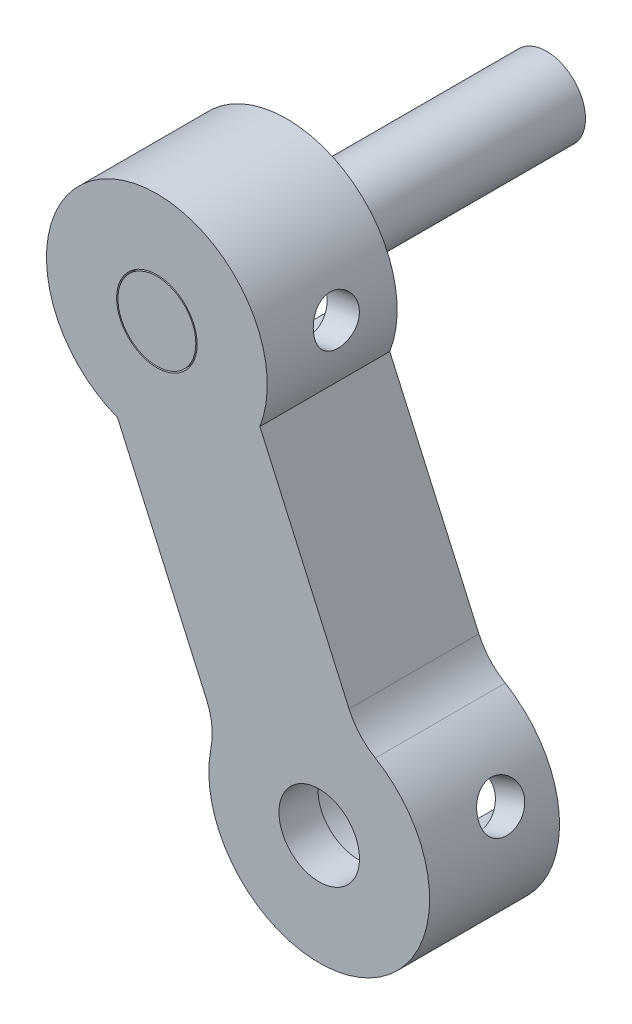
ISO-10303-21;
HEADER;
FILE_DESCRIPTION(('STEP AP214'),'2;1');
FILE_NAME('part.step','',(''),(''),'','','');
FILE_SCHEMA(('AUTOMOTIVE_DESIGN { 1 0 10303 214 1 1 1 1 }'));
ENDSEC;
DATA;
#1=APPLICATION_CONTEXT('core data for automotive mechanical design processes');
#2=APPLICATION_PROTOCOL_DEFINITION('international standard','automotive_design',2000,#1);
#3=PRODUCT_CONTEXT('',#1,'mechanical');
#4=PRODUCT('Part','Part','',(#3));
#5=PRODUCT_RELATED_PRODUCT_CATEGORY('part','',(#4));
#6=PRODUCT_DEFINITION_FORMATION('','',#4);
#7=PRODUCT_DEFINITION_CONTEXT('part definition',#1,'design');
#8=PRODUCT_DEFINITION('design','',#6,#7);
#9=PRODUCT_DEFINITION_SHAPE('','',#8);
#10=(LENGTH_UNIT() NAMED_UNIT(*) SI_UNIT(.MILLI.,.METRE.));
#11=(NAMED_UNIT(*) PLANE_ANGLE_UNIT() SI_UNIT($,.RADIAN.));
#12=(NAMED_UNIT(*) SI_UNIT($,.STERADIAN.) SOLID_ANGLE_UNIT());
#13=UNCERTAINTY_MEASURE_WITH_UNIT(LENGTH_MEASURE(1.E-05),#10,'distance_accuracy_value','');
#14=(GEOMETRIC_REPRESENTATION_CONTEXT(3) GLOBAL_UNCERTAINTY_ASSIGNED_CONTEXT((#13)) GLOBAL_UNIT_ASSIGNED_CONTEXT((#10,
#11,#12)) REPRESENTATION_CONTEXT('',''));
#15=CARTESIAN_POINT('',(0.,0.,0.));
#16=DIRECTION('',(0.,0.,1.));
#17=DIRECTION('',(1.,0.,0.));
#18=AXIS2_PLACEMENT_3D('',#15,#16,#17);
#19=CARTESIAN_POINT('',(-13.5971222503713,29.925411936819,11.5));
#20=DIRECTION('',(0.,0.,1.));
#21=DIRECTION('',(1.,0.,0.));
#22=AXIS2_PLACEMENT_3D('',#19,#20,#21);
#23=CYLINDRICAL_SURFACE('',#22,3.);
#24=CARTESIAN_POINT('',(-13.5971222503713,29.925411936819,11.5));
#25=DIRECTION('',(0.,0.,1.));
#26=DIRECTION('',(1.,0.,0.));
#27=AXIS2_PLACEMENT_3D('',#24,#25,#26);
#28=CIRCLE('',#27,3.);
#29=CARTESIAN_POINT('',(-10.5971222503713,29.925411936819,11.5));
#30=VERTEX_POINT('',#29);
#31=EDGE_CURVE('E11',#30,#30,#28,.T.);
#32=ORIENTED_EDGE('',*,*,#31,.T.);
#33=EDGE_LOOP('',(#32));
#34=FACE_BOUND('',#33,.T.);
#35=CARTESIAN_POINT('',(-13.5971222503713,29.925411936819,41.5));
#36=DIRECTION('',(0.,0.,1.));
#37=DIRECTION('',(1.,0.,0.));
#38=AXIS2_PLACEMENT_3D('',#35,#36,#37);
#39=CIRCLE('',#38,3.);
#40=CARTESIAN_POINT('',(-10.5971222503713,29.925411936819,41.5));
#41=VERTEX_POINT('',#40);
#42=EDGE_CURVE('E50',#41,#41,#39,.T.);
#43=ORIENTED_EDGE('',*,*,#42,.F.);
#44=EDGE_LOOP('',(#43));
#45=FACE_BOUND('',#44,.T.);
#46=ADVANCED_FACE('F47',(#34,#45),#23,.T.);
#47=CARTESIAN_POINT('',(-13.5971222503713,29.925411936819,11.5));
#48=DIRECTION('',(0.,0.,1.));
#49=DIRECTION('',(1.,0.,0.));
#50=AXIS2_PLACEMENT_3D('',#47,#48,#49);
#51=PLANE('',#50);
#52=ORIENTED_EDGE('',*,*,#31,.F.);
#53=EDGE_LOOP('',(#52));
#54=FACE_BOUND('',#53,.T.);
#55=ADVANCED_FACE('F62',(#54),#51,.F.);
#56=CARTESIAN_POINT('',(-13.5971222503713,29.925411936819,41.5));
#57=DIRECTION('',(0.,0.,1.));
#58=DIRECTION('',(1.,0.,0.));
#59=AXIS2_PLACEMENT_3D('',#56,#57,#58);
#60=PLANE('',#59);
#61=ORIENTED_EDGE('',*,*,#42,.T.);
#62=EDGE_LOOP('',(#61));
#63=FACE_BOUND('',#62,.T.);
#64=ADVANCED_FACE('F59',(#63),#60,.T.);
#65=CLOSED_SHELL('',(#46,#55,#64));
#66=MANIFOLD_SOLID_BREP('B2',#65);
#67=CARTESIAN_POINT('',(-1.09712225037129,1.88544046750395,7.84956230400222));
#68=DIRECTION('',(0.,0.,1.));
#69=DIRECTION('',(1.,0.,0.));
#70=AXIS2_PLACEMENT_3D('',#67,#68,#69);
#71=CYLINDRICAL_SURFACE('',#70,8.5);
#72=CARTESIAN_POINT('',(-1.09712225037129,1.88544046750395,31.5));
#73=DIRECTION('',(0.,0.,1.));
#74=DIRECTION('',(1.,0.,0.));
#75=AXIS2_PLACEMENT_3D('',#72,#73,#74);
#76=CIRCLE('',#75,8.5);
#77=CARTESIAN_POINT('',(3.22233619636106,9.20611521283669,31.5));
#78=VERTEX_POINT('',#77);
#79=CARTESIAN_POINT('',(-9.42930975553159,3.5661103871641,31.5));
#80=VERTEX_POINT('',#79);
#81=EDGE_CURVE('E634',#78,#80,#76,.F.);
#82=ORIENTED_EDGE('',*,*,#81,.F.);
#83=DIRECTION('',(0.,0.,1.));
#84=VECTOR('',#83,1.);
#85=CARTESIAN_POINT('',(3.22233619636106,9.20611521283669,7.84956230400222));
#86=LINE('',#85,#84);
#87=CARTESIAN_POINT('',(3.22233619636106,9.20611521283669,41.5));
#88=VERTEX_POINT('',#87);
#89=EDGE_CURVE('E652',#78,#88,#86,.T.);
#90=ORIENTED_EDGE('',*,*,#89,.T.);
#91=CARTESIAN_POINT('',(-1.09712225037129,1.88544046750395,41.5));
#92=DIRECTION('',(0.,0.,1.));
#93=DIRECTION('',(1.,0.,0.));
#94=AXIS2_PLACEMENT_3D('',#91,#92,#93);
#95=CIRCLE('',#94,8.5);
#96=CARTESIAN_POINT('',(-9.42930975553159,3.5661103871641,41.5));
#97=VERTEX_POINT('',#96);
#98=EDGE_CURVE('E633',#97,#88,#95,.T.);
#99=ORIENTED_EDGE('',*,*,#98,.F.);
#100=DIRECTION('',(0.,0.,1.));
#101=VECTOR('',#100,1.);
#102=CARTESIAN_POINT('',(-9.42930975553159,3.5661103871641,7.84956230400222));
#103=LINE('',#102,#101);
#104=EDGE_CURVE('E386',#97,#80,#103,.F.);
#105=ORIENTED_EDGE('',*,*,#104,.T.);
#106=EDGE_LOOP('',(#82,#90,#99,#105));
#107=FACE_BOUND('',#106,.T.);
#108=CARTESIAN_POINT('',(7.31858484996942,3.07954012887019,35.5));
#109=CARTESIAN_POINT('',(7.3185854797486,3.07954410286317,35.4028260396532));
#110=CARTESIAN_POINT('',(7.31743094588016,3.08776128160363,35.3056083726023));
#111=CARTESIAN_POINT('',(7.31271128953919,3.12033341840625,35.113927668718));
#112=CARTESIAN_POINT('',(7.3091442950747,3.14470090829697,35.0194668305173));
#113=CARTESIAN_POINT('',(7.29931674287809,3.20863749879655,34.8361005124985));
#114=CARTESIAN_POINT('',(7.29305894750487,3.24819100509045,34.7471894422291));
#115=CARTESIAN_POINT('',(7.27743559938223,3.34111585001684,34.5772261269787));
#116=CARTESIAN_POINT('',(7.2680701864493,3.39448656696806,34.4961735286448));
#117=CARTESIAN_POINT('',(7.2456089372722,3.51411464691291,34.3430105710338));
#118=CARTESIAN_POINT('',(7.23246464867289,3.58053558950208,34.2710350592075));
#119=CARTESIAN_POINT('',(7.20204207979092,3.72370529883247,34.1392477825047));
#120=CARTESIAN_POINT('',(7.18476350055072,3.80045481227441,34.0794368978518));
#121=CARTESIAN_POINT('',(7.14557283842902,3.96269721326868,33.973150308298));
#122=CARTESIAN_POINT('',(7.1236193278135,4.04826448861869,33.9268032261375));
#123=CARTESIAN_POINT('',(7.07510478966391,4.22490251975853,33.8495905041948));
#124=CARTESIAN_POINT('',(7.04854421977505,4.31597272832594,33.81872332789));
#125=CARTESIAN_POINT('',(6.99149443986236,4.49951445398659,33.7737677336255));
#126=CARTESIAN_POINT('',(6.9610651488198,4.5919487461683,33.7594514439322));
#127=CARTESIAN_POINT('',(6.89665201134979,4.77665733728638,33.7472925994424));
#128=CARTESIAN_POINT('',(6.86266852736262,4.8689316515629,33.7494483665136));
#129=CARTESIAN_POINT('',(6.79271378430365,5.0492520971896,33.7700005591601));
#130=CARTESIAN_POINT('',(6.7567802479912,5.13734101490225,33.7881514822769));
#131=CARTESIAN_POINT('',(6.68375573066098,5.30839118157257,33.8397887948544));
#132=CARTESIAN_POINT('',(6.64666470147465,5.39135221670628,33.8732758233156));
#133=CARTESIAN_POINT('',(6.57258085719244,5.55060427437291,33.9548590559881));
#134=CARTESIAN_POINT('',(6.53559031696466,5.62684751626834,34.0030504861308));
#135=CARTESIAN_POINT('',(6.46359856849392,5.77027639570539,34.1126039198916));
#136=CARTESIAN_POINT('',(6.42859760275988,5.83746093044606,34.1739675247286));
#137=CARTESIAN_POINT('',(6.36164438884661,5.96244027964255,34.3094671494901));
#138=CARTESIAN_POINT('',(6.32976034803723,6.02003886334257,34.3838180389386));
#139=CARTESIAN_POINT('',(6.27148778689696,6.1230220549836,34.5424736860283));
#140=CARTESIAN_POINT('',(6.24509938330184,6.16840640348148,34.6267786550499));
#141=CARTESIAN_POINT('',(6.1992773907361,6.24601357713369,34.8032590701985));
#142=CARTESIAN_POINT('',(6.17986048020693,6.27820486517221,34.8954527457412));
#143=CARTESIAN_POINT('',(6.14927528940594,6.32847968603942,35.0849136829193));
#144=CARTESIAN_POINT('',(6.13810586382014,6.34656517773529,35.1821802380834));
#145=CARTESIAN_POINT('',(6.12486209438162,6.36797316937532,35.3771384856807));
#146=CARTESIAN_POINT('',(6.12262668151185,6.37155712859385,35.4747905689173));
#147=CARTESIAN_POINT('',(6.12695061495697,6.36459078082769,35.6693884592882));
#148=CARTESIAN_POINT('',(6.13350943075216,6.35404132645383,35.766334308672));
#149=CARTESIAN_POINT('',(6.15488896035974,6.31925810337725,35.9557459369636));
#150=CARTESIAN_POINT('',(6.16962421188252,6.29516585417732,36.048247477557));
#151=CARTESIAN_POINT('',(6.20640644604776,6.23397300184239,36.2273008542394));
#152=CARTESIAN_POINT('',(6.22845406136546,6.19687127309433,36.3138521747251));
#153=CARTESIAN_POINT('',(6.2789574013478,6.10989345597836,36.4798597535919));
#154=CARTESIAN_POINT('',(6.30749712668696,6.05984861812149,36.5592019972628));
#155=CARTESIAN_POINT('',(6.36926333482115,5.94833839436772,36.7073420239533));
#156=CARTESIAN_POINT('',(6.40249033013136,5.88687175935594,36.7761386521761));
#157=CARTESIAN_POINT('',(6.47252808036353,5.75276488741944,36.9023830259));
#158=CARTESIAN_POINT('',(6.50938853161499,5.67995845155516,36.9596269124008));
#159=CARTESIAN_POINT('',(6.58443642352807,5.52563379698854,37.0596912922216));
#160=CARTESIAN_POINT('',(6.62262380631305,5.44411595792957,37.1025124137491));
#161=CARTESIAN_POINT('',(6.6983837329635,5.27492693085168,37.1722226027149));
#162=CARTESIAN_POINT('',(6.73595858865205,5.18729548576855,37.1992054791553));
#163=CARTESIAN_POINT('',(6.80920959045461,5.00782769998812,37.2367692531238));
#164=CARTESIAN_POINT('',(6.84488597902804,4.9159918990432,37.2473522500121));
#165=CARTESIAN_POINT('',(6.91248066992904,4.73248249930024,37.2517305363926));
#166=CARTESIAN_POINT('',(6.94445611988901,4.64083710995006,37.2458316563123));
#167=CARTESIAN_POINT('',(7.00457277545334,4.45871383356561,37.2180915918652));
#168=CARTESIAN_POINT('',(7.03271403529362,4.36823593003326,37.1962506330324));
#169=CARTESIAN_POINT('',(7.08464581712309,4.19133620829888,37.1373856571765));
#170=CARTESIAN_POINT('',(7.10844723012653,4.10490465282499,37.100400424893));
#171=CARTESIAN_POINT('',(7.151690638844,3.93836447094919,37.0123364965841));
#172=CARTESIAN_POINT('',(7.17113226504039,3.85825638087083,36.9612566067712));
#173=CARTESIAN_POINT('',(7.20612901853282,3.70540691970761,36.8454321612645));
#174=CARTESIAN_POINT('',(7.22161240122035,3.63281405723092,36.7804699227872));
#175=CARTESIAN_POINT('',(7.24864156977466,3.49879458039844,36.6391696494642));
#176=CARTESIAN_POINT('',(7.26018641792897,3.43737062683406,36.5628289117577));
#177=CARTESIAN_POINT('',(7.2799278976684,3.32704260818699,36.3998803653623));
#178=CARTESIAN_POINT('',(7.28808433544643,3.27829127172515,36.3131641988786));
#179=CARTESIAN_POINT('',(7.30134135139825,3.19599769902188,36.1326324759066));
#180=CARTESIAN_POINT('',(7.30644464676251,3.16244194572574,36.0388233159514));
#181=CARTESIAN_POINT('',(7.3130524048415,3.11804889592078,35.8706966943004));
#182=CARTESIAN_POINT('',(7.31513588401968,3.10363907892756,35.7973245577807));
#183=CARTESIAN_POINT('',(7.31790183767546,3.08438335256718,35.6493101834569));
#184=CARTESIAN_POINT('',(7.31858436605019,3.07953707527348,35.5746679946255));
#185=CARTESIAN_POINT('',(7.31858484996942,3.07954012887019,35.5));
#186=B_SPLINE_CURVE_WITH_KNOTS('',3,(#108,#109,#110,#111,#112,#113,#114,#115,#116,#117,#118,
#119,#120,#121,#122,#123,#124,#125,#126,#127,#128,#129,#130,#131,#132,#133,#134,#135,#136,#137,
#138,#139,#140,#141,#142,#143,#144,#145,#146,#147,#148,#149,#150,#151,#152,#153,#154,#155,#156,
#157,#158,#159,#160,#161,#162,#163,#164,#165,#166,#167,#168,#169,#170,#171,#172,#173,#174,#175,
#176,#177,#178,#179,#180,#181,#182,#183,#184,#185),.UNSPECIFIED.,.T.,.F.,(4,2,2,2,2,2,2,2,2,2,2,
2,2,2,2,2,2,2,2,2,2,2,2,2,2,2,2,2,2,2,2,2,2,2,2,2,2,2,4),(0.,0.291248410109941,0.58272307932389,
0.873899234245207,1.16506229047974,1.46013917865947,1.75523741079963,2.05306846375926,
2.35086994840377,2.64452056558611,2.93814126677126,3.22733231136036,3.5165354065992,
3.80765263306367,4.09880526800797,4.39533262812759,4.69186628630141,4.98910471071327,
5.28630185037215,5.57811605401199,5.86991265449102,6.15871525555436,6.4475428507167,
6.7403446903132,7.03317857028093,7.33079842962615,7.62840532396935,7.92423124331004,
8.22001929063563,8.51035546543439,8.8006875329035,9.09028065985293,9.37989832225806,
9.6744430191927,9.96905779442417,10.2670738865042,10.5648243585657,10.7886268189702,
11.0124206691245),.UNSPECIFIED.);
#187=CARTESIAN_POINT('',(7.31858484996942,3.07954012887019,35.5));
#188=VERTEX_POINT('',#187);
#189=EDGE_CURVE('E273',#188,#188,#186,.T.);
#190=ORIENTED_EDGE('',*,*,#189,.F.);
#191=EDGE_LOOP('',(#190));
#192=FACE_BOUND('',#191,.T.);
#193=ADVANCED_FACE('F88',(#107,#192),#71,.T.);
#194=CARTESIAN_POINT('',(-1.09712225037129,1.88544046750395,38.5));
#195=DIRECTION('',(0.,0.,-1.));
#196=DIRECTION('',(-1.,0.,0.));
#197=AXIS2_PLACEMENT_3D('',#194,#195,#196);
#198=CYLINDRICAL_SURFACE('',#197,4.9);
#199=DIRECTION('',(0.,0.,-1.));
#200=VECTOR('',#199,1.);
#201=CARTESIAN_POINT('',(3.80217856920049,1.80266680416017,43.1083798265215));
#202=LINE('',#201,#200);
#203=CARTESIAN_POINT('',(3.80217856920049,1.80266680416017,38.5));
#204=VERTEX_POINT('',#203);
#205=CARTESIAN_POINT('',(3.80217856920049,1.80266680416017,32.5));
#206=VERTEX_POINT('',#205);
#207=EDGE_CURVE('E209',#204,#206,#202,.T.);
#208=ORIENTED_EDGE('',*,*,#207,.T.);
#209=CARTESIAN_POINT('',(-1.09712225037129,1.88544046750395,32.5));
#210=DIRECTION('',(0.,0.,1.));
#211=DIRECTION('',(1.,0.,0.));
#212=AXIS2_PLACEMENT_3D('',#209,#210,#211);
#213=CIRCLE('',#212,4.9);
#214=CARTESIAN_POINT('',(2.60758173263149,5.09249026417431,32.5));
#215=VERTEX_POINT('',#214);
#216=EDGE_CURVE('E339',#206,#215,#213,.F.);
#217=ORIENTED_EDGE('',*,*,#216,.T.);
#218=DIRECTION('',(0.,0.,-1.));
#219=VECTOR('',#218,1.);
#220=CARTESIAN_POINT('',(2.60758173263149,5.09249026417431,43.1083798265215));
#221=LINE('',#220,#219);
#222=CARTESIAN_POINT('',(2.60758173263149,5.09249026417431,38.5));
#223=VERTEX_POINT('',#222);
#224=EDGE_CURVE('E104',#223,#215,#221,.T.);
#225=ORIENTED_EDGE('',*,*,#224,.F.);
#226=CARTESIAN_POINT('',(-1.09712225037129,1.88544046750395,38.5));
#227=DIRECTION('',(0.,0.,1.));
#228=DIRECTION('',(1.,0.,0.));
#229=AXIS2_PLACEMENT_3D('',#226,#227,#228);
#230=CIRCLE('',#229,4.9);
#231=EDGE_CURVE('E283',#223,#204,#230,.T.);
#232=ORIENTED_EDGE('',*,*,#231,.T.);
#233=EDGE_LOOP('',(#208,#217,#225,#232));
#234=FACE_BOUND('',#233,.T.);
#235=ADVANCED_FACE('F301',(#234),#198,.F.);
#236=CARTESIAN_POINT('',(-13.5971222503713,29.925411936819,41.5));
#237=DIRECTION('',(0.,0.,1.));
#238=DIRECTION('',(1.,0.,0.));
#239=AXIS2_PLACEMENT_3D('',#236,#237,#238);
#240=PLANE('',#239);
#241=CARTESIAN_POINT('',(-13.5971222503713,29.925411936819,41.5));
#242=DIRECTION('',(0.,0.,1.));
#243=DIRECTION('',(1.,0.,0.));
#244=AXIS2_PLACEMENT_3D('',#241,#242,#243);
#245=CIRCLE('',#244,3.1);
#246=CARTESIAN_POINT('',(-10.4971222503713,29.925411936819,41.5));
#247=VERTEX_POINT('',#246);
#248=EDGE_CURVE('E405',#247,#247,#245,.F.);
#249=ORIENTED_EDGE('',*,*,#248,.T.);
#250=EDGE_LOOP('',(#249));
#251=FACE_BOUND('',#250,.T.);
#252=DIRECTION('',(-0.407166123778502,0.913354119521662,0.));
#253=VECTOR('',#252,1.);
#254=CARTESIAN_POINT('',(-8.11699753324131,32.36840867949,41.5));
#255=LINE('',#254,#253);
#256=CARTESIAN_POINT('',(1.19642350859531,11.4765638559046,41.5));
#257=VERTEX_POINT('',#256);
#258=CARTESIAN_POINT('',(-5.66553283886177,26.8692886724151,41.5));
#259=VERTEX_POINT('',#258);
#260=EDGE_CURVE('E644',#257,#259,#255,.T.);
#261=ORIENTED_EDGE('',*,*,#260,.T.);
#262=CARTESIAN_POINT('',(-13.5971222503713,29.925411936819,41.5));
#263=DIRECTION('',(0.,0.,1.));
#264=DIRECTION('',(1.,0.,0.));
#265=AXIS2_PLACEMENT_3D('',#262,#263,#264);
#266=CIRCLE('',#265,8.5);
#267=CARTESIAN_POINT('',(-16.6257822731217,21.9832951870731,41.5));
#268=VERTEX_POINT('',#267);
#269=EDGE_CURVE('E618',#259,#268,#266,.T.);
#270=ORIENTED_EDGE('',*,*,#269,.T.);
#271=DIRECTION('',(0.407166123778502,-0.913354119521662,0.));
#272=VECTOR('',#271,1.);
#273=CARTESIAN_POINT('',(-19.0772469675013,27.4824151941479,41.5));
#274=LINE('',#273,#272);
#275=CARTESIAN_POINT('',(-9.76382592566464,6.59057037056258,41.5));
#276=VERTEX_POINT('',#275);
#277=EDGE_CURVE('E642',#268,#276,#274,.T.);
#278=ORIENTED_EDGE('',*,*,#277,.T.);
#279=CARTESIAN_POINT('',(-14.330596523273,4.55473975167007,41.5));
#280=DIRECTION('',(0.,0.,1.));
#281=DIRECTION('',(1.,0.,0.));
#282=AXIS2_PLACEMENT_3D('',#279,#280,#281);
#283=CIRCLE('',#282,5.);
#284=EDGE_CURVE('E393',#276,#97,#283,.F.);
#285=ORIENTED_EDGE('',*,*,#284,.T.);
#286=ORIENTED_EDGE('',*,*,#98,.T.);
#287=CARTESIAN_POINT('',(5.76319410620362,13.5123944747971,41.5));
#288=DIRECTION('',(0.,0.,1.));
#289=DIRECTION('',(1.,0.,0.));
#290=AXIS2_PLACEMENT_3D('',#287,#288,#289);
#291=CIRCLE('',#290,5.);
#292=EDGE_CURVE('E658',#88,#257,#291,.F.);
#293=ORIENTED_EDGE('',*,*,#292,.T.);
#294=EDGE_LOOP('',(#261,#270,#278,#285,#286,#293));
#295=FACE_BOUND('',#294,.T.);
#296=CARTESIAN_POINT('',(-1.09712225037129,1.88544046750395,41.5));
#297=DIRECTION('',(0.,0.,1.));
#298=DIRECTION('',(1.,0.,0.));
#299=AXIS2_PLACEMENT_3D('',#296,#297,#298);
#300=CIRCLE('',#299,3.1);
#301=CARTESIAN_POINT('',(2.00287774962871,1.88544046750395,41.5));
#302=VERTEX_POINT('',#301);
#303=EDGE_CURVE('E636',#302,#302,#300,.T.);
#304=ORIENTED_EDGE('',*,*,#303,.F.);
#305=EDGE_LOOP('',(#304));
#306=FACE_BOUND('',#305,.T.);
#307=ADVANCED_FACE('F304',(#251,#295,#306),#240,.T.);
#308=CARTESIAN_POINT('',(-13.5971222503713,29.925411936819,31.5));
#309=DIRECTION('',(0.,0.,1.));
#310=DIRECTION('',(1.,0.,0.));
#311=AXIS2_PLACEMENT_3D('',#308,#309,#310);
#312=PLANE('',#311);
#313=CARTESIAN_POINT('',(-1.09712225037129,1.88544046750395,31.5));
#314=DIRECTION('',(0.,0.,1.));
#315=DIRECTION('',(1.,0.,0.));
#316=AXIS2_PLACEMENT_3D('',#313,#314,#315);
#317=CIRCLE('',#316,5.9);
#318=CARTESIAN_POINT('',(3.60171759941099,5.45347971421888,31.5));
#319=VERTEX_POINT('',#318);
#320=CARTESIAN_POINT('',(4.79631443597993,2.16365625420474,31.5));
#321=VERTEX_POINT('',#320);
#322=EDGE_CURVE('E408',#319,#321,#317,.T.);
#323=ORIENTED_EDGE('',*,*,#322,.T.);
#324=DIRECTION('',(-0.939949560004062,-0.341313381876789,0.));
#325=VECTOR('',#324,1.);
#326=CARTESIAN_POINT('',(3.80217856920049,1.80266680416017,31.5));
#327=LINE('',#326,#325);
#328=CARTESIAN_POINT('',(5.21210290920655,2.31463687697534,31.5));
#329=VERTEX_POINT('',#328);
#330=EDGE_CURVE('E227',#329,#321,#327,.T.);
#331=ORIENTED_EDGE('',*,*,#330,.F.);
#332=DIRECTION('',(0.341313381876837,-0.939949560004044,0.));
#333=VECTOR('',#332,1.);
#334=CARTESIAN_POINT('',(4.01750607263763,5.60446033698947,31.5));
#335=LINE('',#334,#333);
#336=CARTESIAN_POINT('',(4.01750607263763,5.60446033698947,31.5));
#337=VERTEX_POINT('',#336);
#338=EDGE_CURVE('E229',#337,#329,#335,.T.);
#339=ORIENTED_EDGE('',*,*,#338,.F.);
#340=DIRECTION('',(0.939949560004069,0.341313381876769,0.));
#341=VECTOR('',#340,1.);
#342=CARTESIAN_POINT('',(2.60758173263149,5.09249026417431,31.5));
#343=LINE('',#342,#341);
#344=EDGE_CURVE('E233',#319,#337,#343,.T.);
#345=ORIENTED_EDGE('',*,*,#344,.F.);
#346=EDGE_LOOP('',(#323,#331,#339,#345));
#347=FACE_BOUND('',#346,.T.);
#348=DIRECTION('',(-0.984807753012209,-0.173648177666921,0.));
#349=VECTOR('',#348,1.);
#350=CARTESIAN_POINT('',(-8.061911904235,32.9322720885109,31.5));
#351=LINE('',#350,#349);
#352=CARTESIAN_POINT('',(-8.061911904235,32.9322720885109,31.5));
#353=VERTEX_POINT('',#352);
#354=CARTESIAN_POINT('',(-8.47807020634316,32.8588921516034,31.5));
#355=VERTEX_POINT('',#354);
#356=EDGE_CURVE('E610',#353,#355,#351,.T.);
#357=ORIENTED_EDGE('',*,*,#356,.T.);
#358=CARTESIAN_POINT('',(-13.5971222503713,29.925411936819,31.5));
#359=DIRECTION('',(0.,0.,1.));
#360=DIRECTION('',(1.,0.,0.));
#361=AXIS2_PLACEMENT_3D('',#358,#359,#360);
#362=CIRCLE('',#361,5.90000000000002);
#363=CARTESIAN_POINT('',(-7.78347749567546,28.9196611395545,31.5));
#364=VERTEX_POINT('',#363);
#365=EDGE_CURVE('E396',#355,#364,#362,.T.);
#366=ORIENTED_EDGE('',*,*,#365,.T.);
#367=DIRECTION('',(0.984807753012208,0.173648177666933,0.));
#368=VECTOR('',#367,1.);
#369=CARTESIAN_POINT('',(-7.3673191935673,28.993041076462,31.5));
#370=LINE('',#369,#368);
#371=CARTESIAN_POINT('',(-7.3673191935673,28.993041076462,31.5));
#372=VERTEX_POINT('',#371);
#373=EDGE_CURVE('E611',#364,#372,#370,.T.);
#374=ORIENTED_EDGE('',*,*,#373,.T.);
#375=DIRECTION('',(-0.173648177666924,0.984807753012209,0.));
#376=VECTOR('',#375,1.);
#377=CARTESIAN_POINT('',(-7.3673191935673,28.993041076462,31.5));
#378=LINE('',#377,#376);
#379=EDGE_CURVE('E603',#372,#353,#378,.T.);
#380=ORIENTED_EDGE('',*,*,#379,.T.);
#381=EDGE_LOOP('',(#357,#366,#374,#380));
#382=FACE_BOUND('',#381,.T.);
#383=DIRECTION('',(0.407166123778502,-0.913354119521662,0.));
#384=VECTOR('',#383,1.);
#385=CARTESIAN_POINT('',(-19.0772469675013,27.4824151941479,31.5));
#386=LINE('',#385,#384);
#387=CARTESIAN_POINT('',(-16.6257822731217,21.9832951870731,31.5));
#388=VERTEX_POINT('',#387);
#389=CARTESIAN_POINT('',(-9.76382592566464,6.59057037056258,31.5));
#390=VERTEX_POINT('',#389);
#391=EDGE_CURVE('E641',#388,#390,#386,.T.);
#392=ORIENTED_EDGE('',*,*,#391,.F.);
#393=CARTESIAN_POINT('',(-13.5971222503713,29.925411936819,31.5));
#394=DIRECTION('',(0.,0.,1.));
#395=DIRECTION('',(1.,0.,0.));
#396=AXIS2_PLACEMENT_3D('',#393,#394,#395);
#397=CIRCLE('',#396,8.5);
#398=CARTESIAN_POINT('',(-5.66553283886177,26.8692886724151,31.5));
#399=VERTEX_POINT('',#398);
#400=EDGE_CURVE('E622',#399,#388,#397,.T.);
#401=ORIENTED_EDGE('',*,*,#400,.F.);
#402=DIRECTION('',(-0.407166123778502,0.913354119521662,0.));
#403=VECTOR('',#402,1.);
#404=CARTESIAN_POINT('',(-8.11699753324131,32.36840867949,31.5));
#405=LINE('',#404,#403);
#406=CARTESIAN_POINT('',(1.19642350859531,11.4765638559046,31.5));
#407=VERTEX_POINT('',#406);
#408=EDGE_CURVE('E645',#407,#399,#405,.T.);
#409=ORIENTED_EDGE('',*,*,#408,.F.);
#410=CARTESIAN_POINT('',(5.76319410620362,13.5123944747971,31.5));
#411=DIRECTION('',(0.,0.,1.));
#412=DIRECTION('',(1.,0.,0.));
#413=AXIS2_PLACEMENT_3D('',#410,#411,#412);
#414=CIRCLE('',#413,5.);
#415=EDGE_CURVE('E398',#407,#78,#414,.T.);
#416=ORIENTED_EDGE('',*,*,#415,.T.);
#417=ORIENTED_EDGE('',*,*,#81,.T.);
#418=CARTESIAN_POINT('',(-14.330596523273,4.55473975167007,31.5));
#419=DIRECTION('',(0.,0.,1.));
#420=DIRECTION('',(1.,0.,0.));
#421=AXIS2_PLACEMENT_3D('',#418,#419,#420);
#422=CIRCLE('',#421,5.);
#423=EDGE_CURVE('E384',#80,#390,#422,.T.);
#424=ORIENTED_EDGE('',*,*,#423,.T.);
#425=EDGE_LOOP('',(#392,#401,#409,#416,#417,#424));
#426=FACE_BOUND('',#425,.T.);
#427=ADVANCED_FACE('F362',(#347,#382,#426),#312,.F.);
#428=CARTESIAN_POINT('',(-19.0772469675013,27.4824151941479,41.5));
#429=DIRECTION('',(0.913354119521662,0.407166123778502,0.));
#430=DIRECTION('',(-0.407166123778502,0.913354119521662,0.));
#431=AXIS2_PLACEMENT_3D('',#428,#429,#430);
#432=PLANE('',#431);
#433=ORIENTED_EDGE('',*,*,#277,.F.);
#434=DIRECTION('',(0.,0.,1.));
#435=VECTOR('',#434,1.);
#436=CARTESIAN_POINT('',(-16.6257822731217,21.9832951870731,31.5));
#437=LINE('',#436,#435);
#438=EDGE_CURVE('E629',#268,#388,#437,.F.);
#439=ORIENTED_EDGE('',*,*,#438,.T.);
#440=ORIENTED_EDGE('',*,*,#391,.T.);
#441=DIRECTION('',(0.,0.,1.));
#442=VECTOR('',#441,1.);
#443=CARTESIAN_POINT('',(-9.76382592566464,6.59057037056257,41.5));
#444=LINE('',#443,#442);
#445=EDGE_CURVE('E388',#390,#276,#444,.T.);
#446=ORIENTED_EDGE('',*,*,#445,.T.);
#447=EDGE_LOOP('',(#433,#439,#440,#446));
#448=FACE_BOUND('',#447,.T.);
#449=ADVANCED_FACE('F366',(#448),#432,.F.);
#450=CARTESIAN_POINT('',(-8.11699753324131,32.36840867949,41.5));
#451=DIRECTION('',(-0.913354119521662,-0.407166123778502,0.));
#452=DIRECTION('',(0.407166123778502,-0.913354119521662,0.));
#453=AXIS2_PLACEMENT_3D('',#450,#451,#452);
#454=PLANE('',#453);
#455=ORIENTED_EDGE('',*,*,#408,.T.);
#456=DIRECTION('',(0.,0.,1.));
#457=VECTOR('',#456,1.);
#458=CARTESIAN_POINT('',(-5.66553283886177,26.8692886724151,31.5));
#459=LINE('',#458,#457);
#460=EDGE_CURVE('E392',#399,#259,#459,.T.);
#461=ORIENTED_EDGE('',*,*,#460,.T.);
#462=ORIENTED_EDGE('',*,*,#260,.F.);
#463=DIRECTION('',(0.,0.,1.));
#464=VECTOR('',#463,1.);
#465=CARTESIAN_POINT('',(1.19642350859531,11.4765638559046,41.5));
#466=LINE('',#465,#464);
#467=EDGE_CURVE('E655',#257,#407,#466,.F.);
#468=ORIENTED_EDGE('',*,*,#467,.T.);
#469=EDGE_LOOP('',(#455,#461,#462,#468));
#470=FACE_BOUND('',#469,.T.);
#471=ADVANCED_FACE('F358',(#470),#454,.F.);
#472=CARTESIAN_POINT('',(-1.09712225037129,1.88544046750395,41.5));
#473=DIRECTION('',(0.,0.,-1.));
#474=DIRECTION('',(-1.,0.,0.));
#475=AXIS2_PLACEMENT_3D('',#472,#473,#474);
#476=CYLINDRICAL_SURFACE('',#475,3.1);
#477=CARTESIAN_POINT('',(-1.09712225037129,1.88544046750395,38.5));
#478=DIRECTION('',(0.,0.,1.));
#479=DIRECTION('',(1.,0.,0.));
#480=AXIS2_PLACEMENT_3D('',#477,#478,#479);
#481=CIRCLE('',#480,3.1);
#482=CARTESIAN_POINT('',(2.00287774962871,1.88544046750395,38.5));
#483=VERTEX_POINT('',#482);
#484=EDGE_CURVE('E402',#483,#483,#481,.T.);
#485=ORIENTED_EDGE('',*,*,#484,.F.);
#486=EDGE_LOOP('',(#485));
#487=FACE_BOUND('',#486,.T.);
#488=ORIENTED_EDGE('',*,*,#303,.T.);
#489=EDGE_LOOP('',(#488));
#490=FACE_BOUND('',#489,.T.);
#491=ADVANCED_FACE('F354',(#487,#490),#476,.F.);
#492=CARTESIAN_POINT('',(5.76319410620362,13.5123944747971,7.84956230400222));
#493=DIRECTION('',(0.,0.,1.));
#494=DIRECTION('',(1.,0.,0.));
#495=AXIS2_PLACEMENT_3D('',#492,#493,#494);
#496=CYLINDRICAL_SURFACE('',#495,5.);
#497=ORIENTED_EDGE('',*,*,#415,.F.);
#498=ORIENTED_EDGE('',*,*,#467,.F.);
#499=ORIENTED_EDGE('',*,*,#292,.F.);
#500=ORIENTED_EDGE('',*,*,#89,.F.);
#501=EDGE_LOOP('',(#497,#498,#499,#500));
#502=FACE_BOUND('',#501,.T.);
#503=ADVANCED_FACE('F357',(#502),#496,.F.);
#504=CARTESIAN_POINT('',(-14.330596523273,4.55473975167007,7.84956230400222));
#505=DIRECTION('',(0.,0.,1.));
#506=DIRECTION('',(1.,0.,0.));
#507=AXIS2_PLACEMENT_3D('',#504,#505,#506);
#508=CYLINDRICAL_SURFACE('',#507,5.);
#509=ORIENTED_EDGE('',*,*,#423,.F.);
#510=ORIENTED_EDGE('',*,*,#104,.F.);
#511=ORIENTED_EDGE('',*,*,#284,.F.);
#512=ORIENTED_EDGE('',*,*,#445,.F.);
#513=EDGE_LOOP('',(#509,#510,#511,#512));
#514=FACE_BOUND('',#513,.T.);
#515=ADVANCED_FACE('F349',(#514),#508,.F.);
#516=CARTESIAN_POINT('',(-13.5971222503713,29.925411936819,31.5));
#517=DIRECTION('',(0.,0.,1.));
#518=DIRECTION('',(1.,0.,0.));
#519=AXIS2_PLACEMENT_3D('',#516,#517,#518);
#520=CYLINDRICAL_SURFACE('',#519,8.5);
#521=CARTESIAN_POINT('',(-5.10170318702147,29.6463869593124,36.05));
#522=CARTESIAN_POINT('',(-5.10170187959465,29.6463907645558,36.1471739603468));
#523=CARTESIAN_POINT('',(-5.10141821181141,29.6546838042576,36.2443916273977));
#524=CARTESIAN_POINT('',(-5.10043481304342,29.6875814056706,36.436072331282));
#525=CARTESIAN_POINT('',(-5.09973475900721,29.7121986341382,36.5305331694827));
#526=CARTESIAN_POINT('',(-5.09835917085665,29.776871473446,36.7138994875015));
#527=CARTESIAN_POINT('',(-5.09768361236447,29.8169112472191,36.8028105577709));
#528=CARTESIAN_POINT('',(-5.09700423655475,29.9111378584267,36.9727738730214));
#529=CARTESIAN_POINT('',(-5.09700038902002,29.9653240593683,37.0538264713552));
#530=CARTESIAN_POINT('',(-5.09843873163233,30.087034027721,37.2069894289662));
#531=CARTESIAN_POINT('',(-5.09990036020322,30.1547272886791,37.2789649407925));
#532=CARTESIAN_POINT('',(-5.105109584466,30.3010008760067,37.4107522174953));
#533=CARTESIAN_POINT('',(-5.10885734550239,30.3795819895223,37.4705631021482));
#534=CARTESIAN_POINT('',(-5.11940478638884,30.5461570661955,37.5768496917021));
#535=CARTESIAN_POINT('',(-5.12623240778007,30.6342314598937,37.6231967738625));
#536=CARTESIAN_POINT('',(-5.14347417609695,30.8165975090425,37.7004094958052));
#537=CARTESIAN_POINT('',(-5.15388796688929,30.9108885463825,37.73127667211));
#538=CARTESIAN_POINT('',(-5.17834271886546,31.1015301146523,37.7762322663745));
#539=CARTESIAN_POINT('',(-5.19233110003182,31.1978336209064,37.7905485560678));
#540=CARTESIAN_POINT('',(-5.22383654329061,31.3908976593927,37.8027074005576));
#541=CARTESIAN_POINT('',(-5.24135324574941,31.4876581440653,37.8005516334864));
#542=CARTESIAN_POINT('',(-5.27907557069797,31.6773583164108,37.7799994408399));
#543=CARTESIAN_POINT('',(-5.29923664052178,31.7703336234513,37.7618485177231));
#544=CARTESIAN_POINT('',(-5.34158540408538,31.9514339323243,37.7102112051456));
#545=CARTESIAN_POINT('',(-5.36377318224,32.0395587318821,37.6767241766844));
#546=CARTESIAN_POINT('',(-5.40920529920057,32.2092217997642,37.5951409440119));
#547=CARTESIAN_POINT('',(-5.43245565903467,32.2907126137782,37.5469495138692));
#548=CARTESIAN_POINT('',(-5.47856313797052,32.4444290920446,37.4373960801084));
#549=CARTESIAN_POINT('',(-5.50142020889859,32.5166536281748,37.3760324752714));
#550=CARTESIAN_POINT('',(-5.54575510620079,32.6513272613035,37.2405328505099));
#551=CARTESIAN_POINT('',(-5.56719968231689,32.7135712895937,37.1661819610614));
#552=CARTESIAN_POINT('',(-5.60678797572449,32.8250791196662,37.0075263139717));
#553=CARTESIAN_POINT('',(-5.62493162289817,32.8743426457288,36.9232213449502));
#554=CARTESIAN_POINT('',(-5.65664458219303,32.9587038727098,36.7467409298015));
#555=CARTESIAN_POINT('',(-5.67020292008742,32.9937676276944,36.6545472542588));
#556=CARTESIAN_POINT('',(-5.69163454318407,33.0485736222662,36.4650863170807));
#557=CARTESIAN_POINT('',(-5.69950861774675,33.0683179892497,36.3678197619166));
#558=CARTESIAN_POINT('',(-5.70885130724106,33.091693482571,36.1728615143193));
#559=CARTESIAN_POINT('',(-5.710433356899,33.0956099801464,36.0752094310827));
#560=CARTESIAN_POINT('',(-5.70737908430661,33.088000918406,35.8806115407118));
#561=CARTESIAN_POINT('',(-5.70274313716249,33.07647629059,35.783665691328));
#562=CARTESIAN_POINT('',(-5.68769990614087,33.0385202885051,35.5942540630364));
#563=CARTESIAN_POINT('',(-5.67735232753658,33.0122430792549,35.501752522443));
#564=CARTESIAN_POINT('',(-5.65170481048974,32.9456119844387,35.3226991457606));
#565=CARTESIAN_POINT('',(-5.63640444352824,32.9052568808193,35.2361478252749));
#566=CARTESIAN_POINT('',(-5.60170090186305,32.8108567101864,35.0701402464081));
#567=CARTESIAN_POINT('',(-5.58224416975628,32.7566309110288,34.9907980027372));
#568=CARTESIAN_POINT('',(-5.54068923856913,32.6361204045867,34.8426579760467));
#569=CARTESIAN_POINT('',(-5.51859075067442,32.5698343783837,34.7738613478239));
#570=CARTESIAN_POINT('',(-5.47279599362267,32.4256373611304,34.6476169741));
#571=CARTESIAN_POINT('',(-5.44907951370843,32.347554081549,34.5903730875992));
#572=CARTESIAN_POINT('',(-5.40184588441239,32.1825775094206,34.4903087077784));
#573=CARTESIAN_POINT('',(-5.37832872639229,32.0956846008062,34.4474875862509));
#574=CARTESIAN_POINT('',(-5.33296394901505,31.9159444262676,34.3777773972851));
#575=CARTESIAN_POINT('',(-5.31110718080225,31.8231359049419,34.3507945208447));
#576=CARTESIAN_POINT('',(-5.26999081384503,31.633705601753,34.3132307468762));
#577=CARTESIAN_POINT('',(-5.25073088296586,31.5370843095894,34.3026477499879));
#578=CARTESIAN_POINT('',(-5.21588445741361,31.3446512857648,34.2982694636074));
#579=CARTESIAN_POINT('',(-5.20023679823616,31.2488574574064,34.3041683436877));
#580=CARTESIAN_POINT('',(-5.17251610313264,31.0590826879026,34.3319084081348));
#581=CARTESIAN_POINT('',(-5.16044301664019,30.9651017211298,34.3537493669676));
#582=CARTESIAN_POINT('',(-5.13988072323562,30.781887055768,34.4126143428235));
#583=CARTESIAN_POINT('',(-5.13138247299673,30.692641883431,34.449599575107));
#584=CARTESIAN_POINT('',(-5.11758644644148,30.5211330083603,34.5376635034159));
#585=CARTESIAN_POINT('',(-5.11228894134271,30.4388698977645,34.5887433932288));
#586=CARTESIAN_POINT('',(-5.10424813060266,30.2822714434441,34.7045678387355));
#587=CARTESIAN_POINT('',(-5.10154981069938,30.2080947766835,34.7695300772128));
#588=CARTESIAN_POINT('',(-5.09810073141572,30.0714203461002,34.9108303505358));
#589=CARTESIAN_POINT('',(-5.09735043555315,30.0089253651297,34.9871710882423));
#590=CARTESIAN_POINT('',(-5.09698284668874,29.8968456497512,35.1501196346377));
#591=CARTESIAN_POINT('',(-5.09737873416772,29.8474182933871,35.2368358011214));
#592=CARTESIAN_POINT('',(-5.09855057350741,29.7640719834941,35.4173675240934));
#593=CARTESIAN_POINT('',(-5.09932618630445,29.7301392466809,35.5111766840486));
#594=CARTESIAN_POINT('',(-5.10049384675404,29.685272311117,35.6793033056996));
#595=CARTESIAN_POINT('',(-5.10093331476984,29.6707192846577,35.7526754422193));
#596=CARTESIAN_POINT('',(-5.10153848194777,29.6512753326422,35.9006898165431));
#597=CARTESIAN_POINT('',(-5.10170419164183,29.6463840353821,35.9753320053746));
#598=CARTESIAN_POINT('',(-5.10170318702147,29.6463869593124,36.05));
#599=B_SPLINE_CURVE_WITH_KNOTS('',3,(#521,#522,#523,#524,#525,#526,#527,#528,#529,#530,#531,
#532,#533,#534,#535,#536,#537,#538,#539,#540,#541,#542,#543,#544,#545,#546,#547,#548,#549,#550,
#551,#552,#553,#554,#555,#556,#557,#558,#559,#560,#561,#562,#563,#564,#565,#566,#567,#568,#569,
#570,#571,#572,#573,#574,#575,#576,#577,#578,#579,#580,#581,#582,#583,#584,#585,#586,#587,#588,
#589,#590,#591,#592,#593,#594,#595,#596,#597,#598),.UNSPECIFIED.,.T.,.F.,(4,2,2,2,2,2,2,2,2,2,2,
2,2,2,2,2,2,2,2,2,2,2,2,2,2,2,2,2,2,2,2,2,2,2,2,2,2,2,4),(0.,0.291248410109941,0.58272307932389,
0.873899234245215,1.16506229047974,1.46013917865947,1.75523741079963,2.05306846375925,
2.35086994840377,2.64452056558611,2.93814126677126,3.22733231136037,3.5165354065992,
3.80765263306367,4.09880526800797,4.3953326281276,4.69186628630141,4.98910471071327,
5.28630185037215,5.57811605401199,5.86991265449102,6.15871525555436,6.44754285071671,
6.74034469031321,7.03317857028093,7.33079842962616,7.62840532396935,7.92423124331003,
8.22001929063563,8.5103554654344,8.80068753290351,9.09028065985294,9.37989832225807,
9.67444301919273,9.96905779442418,10.2670738865043,10.5648243585657,10.7886268189702,
11.0124206691245),.UNSPECIFIED.);
#600=CARTESIAN_POINT('',(-5.10170318702147,29.6463869593124,36.05));
#601=VERTEX_POINT('',#600);
#602=EDGE_CURVE('E279',#601,#601,#599,.T.);
#603=ORIENTED_EDGE('',*,*,#602,.T.);
#604=EDGE_LOOP('',(#603));
#605=FACE_BOUND('',#604,.T.);
#606=ORIENTED_EDGE('',*,*,#438,.F.);
#607=ORIENTED_EDGE('',*,*,#269,.F.);
#608=ORIENTED_EDGE('',*,*,#460,.F.);
#609=ORIENTED_EDGE('',*,*,#400,.T.);
#610=EDGE_LOOP('',(#606,#607,#608,#609));
#611=FACE_BOUND('',#610,.T.);
#612=ADVANCED_FACE('F345',(#605,#611),#520,.T.);
#613=CARTESIAN_POINT('',(-7.3673191935673,28.993041076462,38.5));
#614=DIRECTION('',(-0.173648177666933,0.984807753012208,0.));
#615=DIRECTION('',(-0.984807753012208,-0.173648177666933,0.));
#616=AXIS2_PLACEMENT_3D('',#613,#614,#615);
#617=PLANE('',#616);
#618=ORIENTED_EDGE('',*,*,#373,.F.);
#619=CARTESIAN_POINT('',(-7.78347749567546,28.9196611395545,31.5));
#620=CARTESIAN_POINT('',(-7.87134463735614,28.9041677917585,31.5839377286772));
#621=CARTESIAN_POINT('',(-7.95932400075744,28.8886546562453,31.6677545802958));
#622=CARTESIAN_POINT('',(-8.13554393674384,28.8575823269922,31.835102149397));
#623=CARTESIAN_POINT('',(-8.22378450570093,28.842023133892,31.9186328708195));
#624=CARTESIAN_POINT('',(-8.40056636248228,28.8108517228417,32.0853664213019));
#625=CARTESIAN_POINT('',(-8.48910765138228,28.7952395047019,32.1685692491866));
#626=CARTESIAN_POINT('',(-8.66654258703514,28.763952938226,32.3345890323587));
#627=CARTESIAN_POINT('',(-8.75543623865108,28.7482785890325,32.4174059822858));
#628=CARTESIAN_POINT('',(-8.84453082308561,28.7325688099616,32.5));
#629=B_SPLINE_CURVE_WITH_KNOTS('',3,(#619,#620,#621,#622,#623,#624,#625,#626,#627,#628),
.UNSPECIFIED.,.F.,.F.,(4,2,2,2,4),(0.,0.367499772494956,0.734994464330347,1.10249047216095,
1.46999156971473),.UNSPECIFIED.);
#630=CARTESIAN_POINT('',(-8.84453082308561,28.7325688099616,32.5));
#631=VERTEX_POINT('',#630);
#632=EDGE_CURVE('E333',#364,#631,#629,.T.);
#633=ORIENTED_EDGE('',*,*,#632,.T.);
#634=DIRECTION('',(0.,0.,-1.));
#635=VECTOR('',#634,1.);
#636=CARTESIAN_POINT('',(-8.84453082308561,28.7325688099616,38.5));
#637=LINE('',#636,#635);
#638=CARTESIAN_POINT('',(-8.84453082308561,28.7325688099616,38.5));
#639=VERTEX_POINT('',#638);
#640=EDGE_CURVE('E679',#639,#631,#637,.T.);
#641=ORIENTED_EDGE('',*,*,#640,.F.);
#642=DIRECTION('',(0.984807753012208,0.173648177666933,0.));
#643=VECTOR('',#642,1.);
#644=CARTESIAN_POINT('',(-7.3673191935673,28.993041076462,38.5));
#645=LINE('',#644,#643);
#646=CARTESIAN_POINT('',(-7.3673191935673,28.993041076462,38.5));
#647=VERTEX_POINT('',#646);
#648=EDGE_CURVE('E617',#639,#647,#645,.T.);
#649=ORIENTED_EDGE('',*,*,#648,.T.);
#650=DIRECTION('',(0.,0.,-1.));
#651=VECTOR('',#650,1.);
#652=CARTESIAN_POINT('',(-7.3673191935673,28.993041076462,38.5));
#653=LINE('',#652,#651);
#654=EDGE_CURVE('E605',#647,#372,#653,.T.);
#655=ORIENTED_EDGE('',*,*,#654,.T.);
#656=EDGE_LOOP('',(#618,#633,#641,#649,#655));
#657=FACE_BOUND('',#656,.T.);
#658=ADVANCED_FACE('F341',(#657),#617,.T.);
#659=CARTESIAN_POINT('',(-7.3673191935673,28.993041076462,38.5));
#660=DIRECTION('',(-0.984807753012209,-0.173648177666924,0.));
#661=DIRECTION('',(0.173648177666924,-0.984807753012209,0.));
#662=AXIS2_PLACEMENT_3D('',#659,#660,#661);
#663=PLANE('',#662);
#664=CARTESIAN_POINT('',(-7.71461554890108,30.9626565824865,36.05));
#665=DIRECTION('',(-0.984807753012209,-0.173648177666922,0.));
#666=DIRECTION('',(0.173648177666922,-0.984807753012209,0.));
#667=AXIS2_PLACEMENT_3D('',#664,#665,#666);
#668=CIRCLE('',#667,1.75);
#669=CARTESIAN_POINT('',(-7.41073123798397,29.2392430147151,36.05));
#670=VERTEX_POINT('',#669);
#671=EDGE_CURVE('E280',#670,#670,#668,.T.);
#672=ORIENTED_EDGE('',*,*,#671,.F.);
#673=EDGE_LOOP('',(#672));
#674=FACE_BOUND('',#673,.T.);
#675=ORIENTED_EDGE('',*,*,#379,.F.);
#676=ORIENTED_EDGE('',*,*,#654,.F.);
#677=DIRECTION('',(-0.173648177666924,0.984807753012209,0.));
#678=VECTOR('',#677,1.);
#679=CARTESIAN_POINT('',(-7.3673191935673,28.993041076462,38.5));
#680=LINE('',#679,#678);
#681=CARTESIAN_POINT('',(-8.061911904235,32.9322720885109,38.5));
#682=VERTEX_POINT('',#681);
#683=EDGE_CURVE('E687',#647,#682,#680,.T.);
#684=ORIENTED_EDGE('',*,*,#683,.T.);
#685=DIRECTION('',(0.,0.,-1.));
#686=VECTOR('',#685,1.);
#687=CARTESIAN_POINT('',(-8.061911904235,32.9322720885109,38.5));
#688=LINE('',#687,#686);
#689=EDGE_CURVE('E607',#682,#353,#688,.T.);
#690=ORIENTED_EDGE('',*,*,#689,.T.);
#691=EDGE_LOOP('',(#675,#676,#684,#690));
#692=FACE_BOUND('',#691,.T.);
#693=ADVANCED_FACE('F321',(#674,#692),#663,.T.);
#694=CARTESIAN_POINT('',(-8.061911904235,32.9322720885109,38.5));
#695=DIRECTION('',(0.173648177666921,-0.98480775301221,0.));
#696=DIRECTION('',(0.98480775301221,0.173648177666921,0.));
#697=AXIS2_PLACEMENT_3D('',#694,#695,#696);
#698=PLANE('',#697);
#699=DIRECTION('',(0.,0.,-1.));
#700=VECTOR('',#699,1.);
#701=CARTESIAN_POINT('',(-9.53912353375331,32.6717998220105,38.5));
#702=LINE('',#701,#700);
#703=CARTESIAN_POINT('',(-9.53912353375331,32.6717998220105,38.5));
#704=VERTEX_POINT('',#703);
#705=CARTESIAN_POINT('',(-9.53912353375331,32.6717998220105,32.5));
#706=VERTEX_POINT('',#705);
#707=EDGE_CURVE('E624',#704,#706,#702,.T.);
#708=ORIENTED_EDGE('',*,*,#707,.T.);
#709=CARTESIAN_POINT('',(-9.53912353375331,32.6717998220105,32.5));
#710=CARTESIAN_POINT('',(-9.45002894931878,32.6875096010813,32.4174059822858));
#711=CARTESIAN_POINT('',(-9.36113529770284,32.7031839502749,32.3345890323587));
#712=CARTESIAN_POINT('',(-9.18370036204998,32.7344705167508,32.1685692491866));
#713=CARTESIAN_POINT('',(-9.09515907314998,32.7500827348905,32.0853664213019));
#714=CARTESIAN_POINT('',(-8.91837721636863,32.7812541459408,31.9186328708195));
#715=CARTESIAN_POINT('',(-8.83013664741154,32.796813339041,31.835102149397));
#716=CARTESIAN_POINT('',(-8.65391671142514,32.8278856682942,31.6677545802958));
#717=CARTESIAN_POINT('',(-8.56593734802384,32.8433988038074,31.5839377286772));
#718=CARTESIAN_POINT('',(-8.47807020634316,32.8588921516034,31.5));
#719=B_SPLINE_CURVE_WITH_KNOTS('',3,(#709,#710,#711,#712,#713,#714,#715,#716,#717,#718),
.UNSPECIFIED.,.F.,.F.,(4,2,2,2,4),(0.,0.367501097553781,0.734997105384384,1.10249179721977,
1.46999156971473),.UNSPECIFIED.);
#720=EDGE_CURVE('E324',#706,#355,#719,.T.);
#721=ORIENTED_EDGE('',*,*,#720,.T.);
#722=ORIENTED_EDGE('',*,*,#356,.F.);
#723=ORIENTED_EDGE('',*,*,#689,.F.);
#724=DIRECTION('',(-0.984807753012209,-0.173648177666921,0.));
#725=VECTOR('',#724,1.);
#726=CARTESIAN_POINT('',(-8.061911904235,32.9322720885109,38.5));
#727=LINE('',#726,#725);
#728=EDGE_CURVE('E680',#682,#704,#727,.T.);
#729=ORIENTED_EDGE('',*,*,#728,.T.);
#730=EDGE_LOOP('',(#708,#721,#722,#723,#729));
#731=FACE_BOUND('',#730,.T.);
#732=ADVANCED_FACE('F316',(#731),#698,.T.);
#733=CARTESIAN_POINT('',(-13.5971222503713,29.925411936819,38.5));
#734=DIRECTION('',(0.,0.,-1.));
#735=DIRECTION('',(-1.,0.,0.));
#736=AXIS2_PLACEMENT_3D('',#733,#734,#735);
#737=CYLINDRICAL_SURFACE('',#736,4.9);
#738=ORIENTED_EDGE('',*,*,#640,.T.);
#739=CARTESIAN_POINT('',(-13.5971222503713,29.925411936819,32.5));
#740=DIRECTION('',(0.,0.,1.));
#741=DIRECTION('',(1.,0.,0.));
#742=AXIS2_PLACEMENT_3D('',#739,#740,#741);
#743=CIRCLE('',#742,4.9);
#744=EDGE_CURVE('E330',#631,#706,#743,.F.);
#745=ORIENTED_EDGE('',*,*,#744,.T.);
#746=ORIENTED_EDGE('',*,*,#707,.F.);
#747=CARTESIAN_POINT('',(-13.5971222503713,29.925411936819,38.5));
#748=DIRECTION('',(0.,0.,1.));
#749=DIRECTION('',(1.,0.,0.));
#750=AXIS2_PLACEMENT_3D('',#747,#748,#749);
#751=CIRCLE('',#750,4.9);
#752=EDGE_CURVE('E677',#704,#639,#751,.T.);
#753=ORIENTED_EDGE('',*,*,#752,.T.);
#754=EDGE_LOOP('',(#738,#745,#746,#753));
#755=FACE_BOUND('',#754,.T.);
#756=ADVANCED_FACE('F312',(#755),#737,.F.);
#757=CARTESIAN_POINT('',(-13.5971222503713,29.925411936819,38.5));
#758=DIRECTION('',(0.,0.,1.));
#759=DIRECTION('',(1.,0.,0.));
#760=AXIS2_PLACEMENT_3D('',#757,#758,#759);
#761=PLANE('',#760);
#762=CARTESIAN_POINT('',(-13.5971222503713,29.925411936819,38.5));
#763=DIRECTION('',(0.,0.,-1.));
#764=DIRECTION('',(-1.,0.,0.));
#765=AXIS2_PLACEMENT_3D('',#762,#763,#764);
#766=CIRCLE('',#765,3.1);
#767=CARTESIAN_POINT('',(-16.6971222503713,29.925411936819,38.5));
#768=VERTEX_POINT('',#767);
#769=EDGE_CURVE('E674',#768,#768,#766,.T.);
#770=ORIENTED_EDGE('',*,*,#769,.F.);
#771=EDGE_LOOP('',(#770));
#772=FACE_BOUND('',#771,.T.);
#773=ORIENTED_EDGE('',*,*,#648,.F.);
#774=ORIENTED_EDGE('',*,*,#752,.F.);
#775=ORIENTED_EDGE('',*,*,#728,.F.);
#776=ORIENTED_EDGE('',*,*,#683,.F.);
#777=EDGE_LOOP('',(#773,#774,#775,#776));
#778=FACE_BOUND('',#777,.T.);
#779=ADVANCED_FACE('F308',(#772,#778),#761,.F.);
#780=CARTESIAN_POINT('',(-13.5971222503713,29.925411936819,41.501));
#781=DIRECTION('',(0.,0.,-1.));
#782=DIRECTION('',(-1.,0.,0.));
#783=AXIS2_PLACEMENT_3D('',#780,#781,#782);
#784=CYLINDRICAL_SURFACE('',#783,3.1);
#785=ORIENTED_EDGE('',*,*,#248,.F.);
#786=EDGE_LOOP('',(#785));
#787=FACE_BOUND('',#786,.T.);
#788=ORIENTED_EDGE('',*,*,#769,.T.);
#789=EDGE_LOOP('',(#788));
#790=FACE_BOUND('',#789,.T.);
#791=ADVANCED_FACE('F299',(#787,#790),#784,.F.);
#792=CARTESIAN_POINT('',(-1.09712225037129,1.88544046750395,38.5));
#793=DIRECTION('',(0.,0.,1.));
#794=DIRECTION('',(1.,0.,0.));
#795=AXIS2_PLACEMENT_3D('',#792,#793,#794);
#796=PLANE('',#795);
#797=ORIENTED_EDGE('',*,*,#484,.T.);
#798=EDGE_LOOP('',(#797));
#799=FACE_BOUND('',#798,.T.);
#800=ORIENTED_EDGE('',*,*,#231,.F.);
#801=DIRECTION('',(0.939949560004069,0.341313381876769,0.));
#802=VECTOR('',#801,1.);
#803=CARTESIAN_POINT('',(2.60758173263149,5.09249026417431,38.5));
#804=LINE('',#803,#802);
#805=CARTESIAN_POINT('',(4.01750607263763,5.60446033698947,38.5));
#806=VERTEX_POINT('',#805);
#807=EDGE_CURVE('E225',#223,#806,#804,.T.);
#808=ORIENTED_EDGE('',*,*,#807,.T.);
#809=DIRECTION('',(0.341313381876837,-0.939949560004045,0.));
#810=VECTOR('',#809,1.);
#811=CARTESIAN_POINT('',(4.01750607263763,5.60446033698947,38.5));
#812=LINE('',#811,#810);
#813=CARTESIAN_POINT('',(5.21210290920655,2.31463687697534,38.5));
#814=VERTEX_POINT('',#813);
#815=EDGE_CURVE('E218',#806,#814,#812,.T.);
#816=ORIENTED_EDGE('',*,*,#815,.T.);
#817=DIRECTION('',(-0.939949560004062,-0.341313381876789,0.));
#818=VECTOR('',#817,1.);
#819=CARTESIAN_POINT('',(3.80217856920049,1.80266680416017,38.5));
#820=LINE('',#819,#818);
#821=EDGE_CURVE('E206',#814,#204,#820,.T.);
#822=ORIENTED_EDGE('',*,*,#821,.T.);
#823=EDGE_LOOP('',(#800,#808,#816,#822));
#824=FACE_BOUND('',#823,.T.);
#825=ADVANCED_FACE('F224',(#799,#824),#796,.F.);
#826=CARTESIAN_POINT('',(-1.09712225037129,1.88544046750395,31.5));
#827=DIRECTION('',(0.,0.,-1.));
#828=DIRECTION('',(-1.,0.,0.));
#829=AXIS2_PLACEMENT_3D('',#826,#827,#828);
#830=CONICAL_SURFACE('',#829,5.9,0.785398163397445);
#831=CARTESIAN_POINT('',(4.79651128401328,2.16372773343175,31.4998));
#832=CARTESIAN_POINT('',(4.71402475252348,2.13377532085554,31.5836058420189));
#833=CARTESIAN_POINT('',(4.63145880635515,2.1037940713144,31.6673233462973));
#834=CARTESIAN_POINT('',(4.46614215068737,2.043764481188,31.8345502661461));
#835=CARTESIAN_POINT('',(4.38339144258634,2.01371614111054,31.9180596832816));
#836=CARTESIAN_POINT('',(4.21767792428778,1.95354244269109,32.0848404430811));
#837=CARTESIAN_POINT('',(4.13471511367804,1.92341708419941,32.1681117852819));
#838=CARTESIAN_POINT('',(3.96854151877403,1.86307632330255,32.3343752462258));
#839=CARTESIAN_POINT('',(3.88533073261074,1.83286092021869,32.4173673628542));
#840=CARTESIAN_POINT('',(3.80197856920048,1.80259418039472,32.5001987440697));
#841=B_SPLINE_CURVE_WITH_KNOTS('',3,(#831,#832,#833,#834,#835,#836,#837,#838,#839,#840),
.UNSPECIFIED.,.F.,.F.,(4,2,2,2,4),(0.,0.364034883990349,0.728067021955929,1.09209986794146,
1.45613546465338),.UNSPECIFIED.);
#842=EDGE_CURVE('E248',#321,#206,#841,.T.);
#843=ORIENTED_EDGE('',*,*,#842,.F.);
#844=ORIENTED_EDGE('',*,*,#322,.F.);
#845=CARTESIAN_POINT('',(2.60738173263149,5.09241764040886,32.5001987440697));
#846=CARTESIAN_POINT('',(2.69073389604175,5.12268438023283,32.4173673628542));
#847=CARTESIAN_POINT('',(2.77394468220504,5.15289978331669,32.3343752462258));
#848=CARTESIAN_POINT('',(2.94011827710906,5.21324054421355,32.1681117852819));
#849=CARTESIAN_POINT('',(3.02308108771881,5.24336590270523,32.0848404430811));
#850=CARTESIAN_POINT('',(3.18879460601737,5.30353960112468,31.9180596832816));
#851=CARTESIAN_POINT('',(3.27154531411841,5.33358794120214,31.8345502661461));
#852=CARTESIAN_POINT('',(3.4368619697862,5.39361753132853,31.6673233462973));
#853=CARTESIAN_POINT('',(3.51942791595454,5.42359878086968,31.5836058420189));
#854=CARTESIAN_POINT('',(3.60191444744434,5.45355119344589,31.4998));
#855=B_SPLINE_CURVE_WITH_KNOTS('',3,(#845,#846,#847,#848,#849,#850,#851,#852,#853,#854),
.UNSPECIFIED.,.F.,.F.,(4,2,2,2,4),(0.,0.364035596711918,0.728068442697459,1.09210058066305,
1.45613546465341),.UNSPECIFIED.);
#856=EDGE_CURVE('E241',#215,#319,#855,.T.);
#857=ORIENTED_EDGE('',*,*,#856,.F.);
#858=ORIENTED_EDGE('',*,*,#216,.F.);
#859=EDGE_LOOP('',(#843,#844,#857,#858));
#860=FACE_BOUND('',#859,.T.);
#861=ADVANCED_FACE('F255',(#860),#830,.F.);
#862=CARTESIAN_POINT('',(-13.5971222503713,29.925411936819,31.5));
#863=DIRECTION('',(0.,0.,-1.));
#864=DIRECTION('',(-1.,0.,0.));
#865=AXIS2_PLACEMENT_3D('',#862,#863,#864);
#866=CONICAL_SURFACE('',#865,5.90000000000002,0.78539816339745);
#867=ORIENTED_EDGE('',*,*,#720,.F.);
#868=ORIENTED_EDGE('',*,*,#744,.F.);
#869=ORIENTED_EDGE('',*,*,#632,.F.);
#870=ORIENTED_EDGE('',*,*,#365,.F.);
#871=EDGE_LOOP('',(#867,#868,#869,#870));
#872=FACE_BOUND('',#871,.T.);
#873=ADVANCED_FACE('F90',(#872),#866,.F.);
#874=CARTESIAN_POINT('',(48.0136670514128,40.7890563934674,36.05));
#875=DIRECTION('',(-0.984807753012209,-0.173648177666922,0.));
#876=DIRECTION('',(0.173648177666922,-0.984807753012209,0.));
#877=AXIS2_PLACEMENT_3D('',#874,#875,#876);
#878=CYLINDRICAL_SURFACE('',#877,1.75);
#879=ORIENTED_EDGE('',*,*,#602,.F.);
#880=EDGE_LOOP('',(#879));
#881=FACE_BOUND('',#880,.T.);
#882=ORIENTED_EDGE('',*,*,#671,.T.);
#883=EDGE_LOOP('',(#882));
#884=FACE_BOUND('',#883,.T.);
#885=ADVANCED_FACE('F291',(#881,#884),#878,.F.);
#886=CARTESIAN_POINT('',(18.1365333578729,8.86954293516826,35.5));
#887=DIRECTION('',(-0.939949560004044,-0.341313381876838,0.));
#888=DIRECTION('',(0.341313381876838,-0.939949560004044,0.));
#889=AXIS2_PLACEMENT_3D('',#886,#887,#888);
#890=CYLINDRICAL_SURFACE('',#889,1.75);
#891=CARTESIAN_POINT('',(4.6148044909221,3.95954860698239,35.5));
#892=DIRECTION('',(0.939949560004044,0.341313381876837,0.));
#893=DIRECTION('',(-0.341313381876837,0.939949560004045,0.));
#894=AXIS2_PLACEMENT_3D('',#891,#892,#893);
#895=CIRCLE('',#894,1.75);
#896=CARTESIAN_POINT('',(4.01750607263763,5.60446033698947,35.5));
#897=VERTEX_POINT('',#896);
#898=CARTESIAN_POINT('',(5.21210290920655,2.31463687697534,35.5));
#899=VERTEX_POINT('',#898);
#900=EDGE_CURVE('E45',#897,#899,#895,.T.);
#901=ORIENTED_EDGE('',*,*,#900,.F.);
#902=EDGE_CURVE('E93',#899,#897,#895,.T.);
#903=ORIENTED_EDGE('',*,*,#902,.F.);
#904=EDGE_LOOP('',(#901,#903));
#905=FACE_BOUND('',#904,.T.);
#906=ORIENTED_EDGE('',*,*,#189,.T.);
#907=EDGE_LOOP('',(#906));
#908=FACE_BOUND('',#907,.T.);
#909=ADVANCED_FACE('F270',(#905,#908),#890,.F.);
#910=CARTESIAN_POINT('',(4.01750607263763,5.60446033698947,43.1083798265215));
#911=DIRECTION('',(0.939949560004044,0.341313381876837,0.));
#912=DIRECTION('',(-0.341313381876837,0.939949560004045,0.));
#913=AXIS2_PLACEMENT_3D('',#910,#911,#912);
#914=PLANE('',#913);
#915=ORIENTED_EDGE('',*,*,#900,.T.);
#916=DIRECTION('',(0.,0.,-1.));
#917=VECTOR('',#916,1.);
#918=CARTESIAN_POINT('',(5.21210290920655,2.31463687697534,43.1083798265215));
#919=LINE('',#918,#917);
#920=EDGE_CURVE('E112',#814,#899,#919,.T.);
#921=ORIENTED_EDGE('',*,*,#920,.F.);
#922=ORIENTED_EDGE('',*,*,#815,.F.);
#923=DIRECTION('',(0.,0.,-1.));
#924=VECTOR('',#923,1.);
#925=CARTESIAN_POINT('',(4.01750607263763,5.60446033698947,43.1083798265215));
#926=LINE('',#925,#924);
#927=EDGE_CURVE('E239',#806,#897,#926,.T.);
#928=ORIENTED_EDGE('',*,*,#927,.T.);
#929=EDGE_LOOP('',(#915,#921,#922,#928));
#930=FACE_BOUND('',#929,.T.);
#931=ADVANCED_FACE('F216',(#930),#914,.F.);
#932=CARTESIAN_POINT('',(3.80217856920049,1.80266680416017,43.1083798265215));
#933=DIRECTION('',(0.341313381876789,-0.939949560004062,0.));
#934=DIRECTION('',(0.939949560004062,0.341313381876789,0.));
#935=AXIS2_PLACEMENT_3D('',#932,#933,#934);
#936=PLANE('',#935);
#937=ORIENTED_EDGE('',*,*,#842,.T.);
#938=ORIENTED_EDGE('',*,*,#207,.F.);
#939=ORIENTED_EDGE('',*,*,#821,.F.);
#940=ORIENTED_EDGE('',*,*,#920,.T.);
#941=EDGE_CURVE('E222',#899,#329,#919,.T.);
#942=ORIENTED_EDGE('',*,*,#941,.T.);
#943=ORIENTED_EDGE('',*,*,#330,.T.);
#944=EDGE_LOOP('',(#937,#938,#939,#940,#942,#943));
#945=FACE_BOUND('',#944,.T.);
#946=ADVANCED_FACE('F207',(#945),#936,.F.);
#947=CARTESIAN_POINT('',(2.60758173263149,5.09249026417431,43.1083798265215));
#948=DIRECTION('',(-0.341313381876769,0.939949560004069,0.));
#949=DIRECTION('',(-0.939949560004069,-0.341313381876769,0.));
#950=AXIS2_PLACEMENT_3D('',#947,#948,#949);
#951=PLANE('',#950);
#952=ORIENTED_EDGE('',*,*,#927,.F.);
#953=ORIENTED_EDGE('',*,*,#807,.F.);
#954=ORIENTED_EDGE('',*,*,#224,.T.);
#955=ORIENTED_EDGE('',*,*,#856,.T.);
#956=ORIENTED_EDGE('',*,*,#344,.T.);
#957=EDGE_CURVE('E235',#897,#337,#926,.T.);
#958=ORIENTED_EDGE('',*,*,#957,.F.);
#959=EDGE_LOOP('',(#952,#953,#954,#955,#956,#958));
#960=FACE_BOUND('',#959,.T.);
#961=ADVANCED_FACE('F258',(#960),#951,.F.);
#962=ORIENTED_EDGE('',*,*,#902,.T.);
#963=ORIENTED_EDGE('',*,*,#957,.T.);
#964=ORIENTED_EDGE('',*,*,#338,.T.);
#965=ORIENTED_EDGE('',*,*,#941,.F.);
#966=EDGE_LOOP('',(#962,#963,#964,#965));
#967=FACE_BOUND('',#966,.T.);
#968=ADVANCED_FACE('F261',(#967),#914,.F.);
#969=CLOSED_SHELL('',(#193,#235,#307,#427,#449,#471,#491,#503,#515,#612,#658,#693,#732,#756,
#779,#791,#825,#861,#873,#885,#909,#931,#946,#961,#968));
#970=MANIFOLD_SOLID_BREP('B6',#969);
#971=ADVANCED_BREP_SHAPE_REPRESENTATION('',(#18,#66,#970),#14);
#972=SHAPE_DEFINITION_REPRESENTATION(#9,#971);
ENDSEC;
END-ISO-10303-21;
